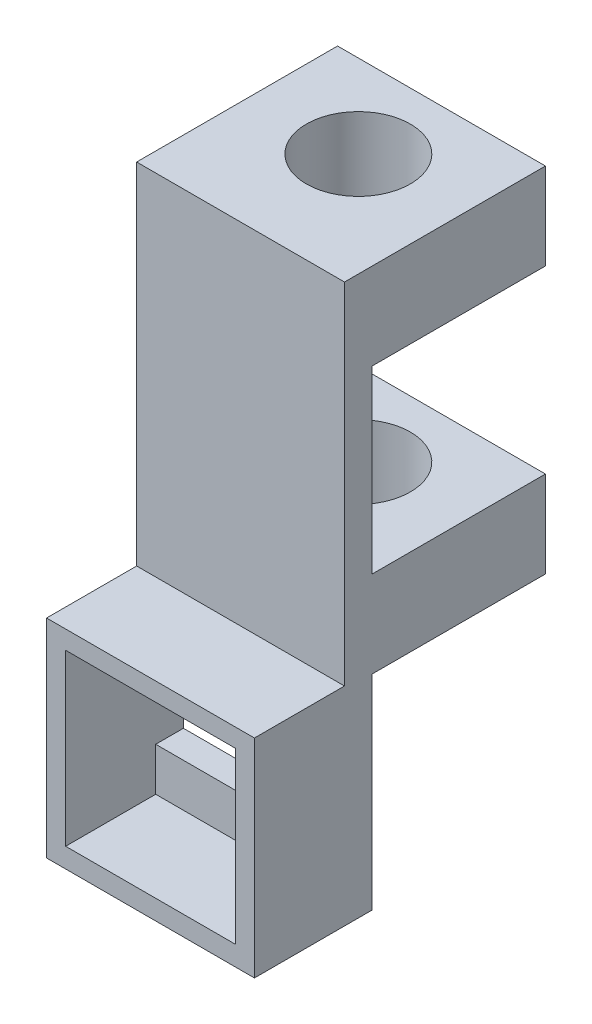
ISO-10303-21;
HEADER;
FILE_DESCRIPTION(('STEP AP214'),'2;1');
FILE_NAME('part.step','',(''),(''),'','','');
FILE_SCHEMA(('AUTOMOTIVE_DESIGN { 1 0 10303 214 1 1 1 1 }'));
ENDSEC;
DATA;
#1=APPLICATION_CONTEXT('core data for automotive mechanical design processes');
#2=APPLICATION_PROTOCOL_DEFINITION('international standard','automotive_design',2000,#1);
#3=PRODUCT_CONTEXT('',#1,'mechanical');
#4=PRODUCT('Part','Part','',(#3));
#5=PRODUCT_RELATED_PRODUCT_CATEGORY('part','',(#4));
#6=PRODUCT_DEFINITION_FORMATION('','',#4);
#7=PRODUCT_DEFINITION_CONTEXT('part definition',#1,'design');
#8=PRODUCT_DEFINITION('design','',#6,#7);
#9=PRODUCT_DEFINITION_SHAPE('','',#8);
#10=(LENGTH_UNIT() NAMED_UNIT(*) SI_UNIT(.MILLI.,.METRE.));
#11=(NAMED_UNIT(*) PLANE_ANGLE_UNIT() SI_UNIT($,.RADIAN.));
#12=(NAMED_UNIT(*) SI_UNIT($,.STERADIAN.) SOLID_ANGLE_UNIT());
#13=UNCERTAINTY_MEASURE_WITH_UNIT(LENGTH_MEASURE(1.E-05),#10,'distance_accuracy_value','');
#14=(GEOMETRIC_REPRESENTATION_CONTEXT(3) GLOBAL_UNCERTAINTY_ASSIGNED_CONTEXT((#13)) GLOBAL_UNIT_ASSIGNED_CONTEXT((#10,
#11,#12)) REPRESENTATION_CONTEXT('',''));
#15=CARTESIAN_POINT('',(0.,0.,0.));
#16=DIRECTION('',(0.,0.,1.));
#17=DIRECTION('',(1.,0.,0.));
#18=AXIS2_PLACEMENT_3D('',#15,#16,#17);
#19=CARTESIAN_POINT('',(0.,0.,1.016));
#20=DIRECTION('',(0.,0.,-1.));
#21=DIRECTION('',(-1.,0.,0.));
#22=AXIS2_PLACEMENT_3D('',#19,#20,#21);
#23=PLANE('',#22);
#24=DIRECTION('',(-1.,0.,0.));
#25=VECTOR('',#24,1.);
#26=CARTESIAN_POINT('',(-3.1115,-4.86634895045482,1.016));
#27=LINE('',#26,#25);
#28=CARTESIAN_POINT('',(3.1115,-4.86634895045482,1.016));
#29=VERTEX_POINT('',#28);
#30=CARTESIAN_POINT('',(-3.1115,-4.86634895045482,1.016));
#31=VERTEX_POINT('',#30);
#32=EDGE_CURVE('E188',#29,#31,#27,.T.);
#33=ORIENTED_EDGE('',*,*,#32,.F.);
#34=DIRECTION('',(0.,1.,0.));
#35=VECTOR('',#34,1.);
#36=CARTESIAN_POINT('',(3.1115,-9.50184895045482,1.016));
#37=LINE('',#36,#35);
#38=CARTESIAN_POINT('',(3.1115,-3.27884895045482,1.016));
#39=VERTEX_POINT('',#38);
#40=EDGE_CURVE('E383',#29,#39,#37,.T.);
#41=ORIENTED_EDGE('',*,*,#40,.T.);
#42=DIRECTION('',(-1.,0.,0.));
#43=VECTOR('',#42,1.);
#44=CARTESIAN_POINT('',(-3.1115,-3.27884895045482,1.016));
#45=LINE('',#44,#43);
#46=CARTESIAN_POINT('',(-3.1115,-3.27884895045482,1.016));
#47=VERTEX_POINT('',#46);
#48=EDGE_CURVE('E197',#39,#47,#45,.T.);
#49=ORIENTED_EDGE('',*,*,#48,.T.);
#50=DIRECTION('',(0.,-1.,0.));
#51=VECTOR('',#50,1.);
#52=CARTESIAN_POINT('',(-3.1115,-9.50184895045482,1.016));
#53=LINE('',#52,#51);
#54=EDGE_CURVE('E179',#47,#31,#53,.T.);
#55=ORIENTED_EDGE('',*,*,#54,.T.);
#56=EDGE_LOOP('',(#33,#41,#49,#55));
#57=FACE_BOUND('',#56,.T.);
#58=ADVANCED_FACE('F39',(#57),#23,.F.);
#59=DIRECTION('',(1.,0.,0.));
#60=VECTOR('',#59,1.);
#61=CARTESIAN_POINT('',(1.524,-7.91434895045482,1.016));
#62=LINE('',#61,#60);
#63=CARTESIAN_POINT('',(-3.1115,-7.91434895045482,1.016));
#64=VERTEX_POINT('',#63);
#65=CARTESIAN_POINT('',(3.1115,-7.91434895045482,1.016));
#66=VERTEX_POINT('',#65);
#67=EDGE_CURVE('E185',#64,#66,#62,.T.);
#68=ORIENTED_EDGE('',*,*,#67,.F.);
#69=CARTESIAN_POINT('',(-3.1115,-9.50184895045482,1.016));
#70=VERTEX_POINT('',#69);
#71=EDGE_CURVE('E200',#64,#70,#53,.T.);
#72=ORIENTED_EDGE('',*,*,#71,.T.);
#73=DIRECTION('',(1.,0.,0.));
#74=VECTOR('',#73,1.);
#75=CARTESIAN_POINT('',(-3.1115,-9.50184895045482,1.016));
#76=LINE('',#75,#74);
#77=CARTESIAN_POINT('',(3.1115,-9.50184895045482,1.016));
#78=VERTEX_POINT('',#77);
#79=EDGE_CURVE('E199',#70,#78,#76,.T.);
#80=ORIENTED_EDGE('',*,*,#79,.T.);
#81=EDGE_CURVE('E388',#78,#66,#37,.T.);
#82=ORIENTED_EDGE('',*,*,#81,.T.);
#83=EDGE_LOOP('',(#68,#72,#80,#82));
#84=FACE_BOUND('',#83,.T.);
#85=ADVANCED_FACE('F406',(#84),#23,.F.);
#86=DIRECTION('',(-1.,0.,0.));
#87=VECTOR('',#86,1.);
#88=CARTESIAN_POINT('',(-3.81000000000002,-2.6035,1.016));
#89=LINE('',#88,#87);
#90=CARTESIAN_POINT('',(3.81000000000001,-2.6035,1.016));
#91=VERTEX_POINT('',#90);
#92=CARTESIAN_POINT('',(-3.81000000000002,-2.6035,1.016));
#93=VERTEX_POINT('',#92);
#94=EDGE_CURVE('E225',#91,#93,#89,.T.);
#95=ORIENTED_EDGE('',*,*,#94,.F.);
#96=DIRECTION('',(0.,1.,0.));
#97=VECTOR('',#96,1.);
#98=CARTESIAN_POINT('',(3.81000000000001,-10.2235,1.016));
#99=LINE('',#98,#97);
#100=CARTESIAN_POINT('',(3.81000000000001,10.2235,1.016));
#101=VERTEX_POINT('',#100);
#102=EDGE_CURVE('E326',#91,#101,#99,.T.);
#103=ORIENTED_EDGE('',*,*,#102,.T.);
#104=DIRECTION('',(-1.,0.,0.));
#105=VECTOR('',#104,1.);
#106=CARTESIAN_POINT('',(-3.80999999999999,10.2235,1.016));
#107=LINE('',#106,#105);
#108=CARTESIAN_POINT('',(-3.80999999999999,10.2235,1.016));
#109=VERTEX_POINT('',#108);
#110=EDGE_CURVE('E329',#101,#109,#107,.T.);
#111=ORIENTED_EDGE('',*,*,#110,.T.);
#112=DIRECTION('',(0.,-1.,0.));
#113=VECTOR('',#112,1.);
#114=CARTESIAN_POINT('',(-3.80999999999999,-10.2235,1.016));
#115=LINE('',#114,#113);
#116=EDGE_CURVE('E333',#109,#93,#115,.T.);
#117=ORIENTED_EDGE('',*,*,#116,.T.);
#118=EDGE_LOOP('',(#95,#103,#111,#117));
#119=FACE_BOUND('',#118,.T.);
#120=ADVANCED_FACE('F432',(#119),#23,.F.);
#121=CARTESIAN_POINT('',(0.,0.,0.));
#122=DIRECTION('',(0.,0.,-1.));
#123=DIRECTION('',(-1.,0.,0.));
#124=AXIS2_PLACEMENT_3D('',#121,#122,#123);
#125=PLANE('',#124);
#126=DIRECTION('',(0.,-1.,0.));
#127=VECTOR('',#126,1.);
#128=CARTESIAN_POINT('',(3.1115,0.,0.));
#129=LINE('',#128,#127);
#130=CARTESIAN_POINT('',(3.1115,-4.86634895045482,0.));
#131=VERTEX_POINT('',#130);
#132=CARTESIAN_POINT('',(3.1115,-7.91434895045482,0.));
#133=VERTEX_POINT('',#132);
#134=EDGE_CURVE('E11',#131,#133,#129,.T.);
#135=ORIENTED_EDGE('',*,*,#134,.F.);
#136=DIRECTION('',(1.,0.,0.));
#137=VECTOR('',#136,1.);
#138=CARTESIAN_POINT('',(0.,-4.86634895045482,0.));
#139=LINE('',#138,#137);
#140=CARTESIAN_POINT('',(-3.1115,-4.86634895045482,0.));
#141=VERTEX_POINT('',#140);
#142=EDGE_CURVE('E361',#141,#131,#139,.T.);
#143=ORIENTED_EDGE('',*,*,#142,.F.);
#144=DIRECTION('',(0.,1.,0.));
#145=VECTOR('',#144,1.);
#146=CARTESIAN_POINT('',(-3.1115,0.,0.));
#147=LINE('',#146,#145);
#148=CARTESIAN_POINT('',(-3.1115,-7.91434895045482,0.));
#149=VERTEX_POINT('',#148);
#150=EDGE_CURVE('E182',#149,#141,#147,.T.);
#151=ORIENTED_EDGE('',*,*,#150,.F.);
#152=DIRECTION('',(-1.,0.,0.));
#153=VECTOR('',#152,1.);
#154=CARTESIAN_POINT('',(0.,-7.91434895045482,0.));
#155=LINE('',#154,#153);
#156=EDGE_CURVE('E48',#133,#149,#155,.T.);
#157=ORIENTED_EDGE('',*,*,#156,.F.);
#158=EDGE_LOOP('',(#135,#143,#151,#157));
#159=FACE_BOUND('',#158,.T.);
#160=DIRECTION('',(0.,-1.,0.));
#161=VECTOR('',#160,1.);
#162=CARTESIAN_POINT('',(-3.80999999999999,-10.2235,0.));
#163=LINE('',#162,#161);
#164=CARTESIAN_POINT('',(-3.80999999999999,-2.7305,0.));
#165=VERTEX_POINT('',#164);
#166=CARTESIAN_POINT('',(-3.80999999999999,-10.2235,0.));
#167=VERTEX_POINT('',#166);
#168=EDGE_CURVE('E341',#165,#167,#163,.T.);
#169=ORIENTED_EDGE('',*,*,#168,.F.);
#170=DIRECTION('',(-1.,0.,0.));
#171=VECTOR('',#170,1.);
#172=CARTESIAN_POINT('',(3.81000000000001,-2.7305,0.));
#173=LINE('',#172,#171);
#174=CARTESIAN_POINT('',(3.81000000000001,-2.7305,0.));
#175=VERTEX_POINT('',#174);
#176=EDGE_CURVE('E265',#175,#165,#173,.T.);
#177=ORIENTED_EDGE('',*,*,#176,.F.);
#178=DIRECTION('',(0.,1.,0.));
#179=VECTOR('',#178,1.);
#180=CARTESIAN_POINT('',(3.81000000000001,-10.2235,0.));
#181=LINE('',#180,#179);
#182=CARTESIAN_POINT('',(3.81000000000001,-10.2235,0.));
#183=VERTEX_POINT('',#182);
#184=EDGE_CURVE('E337',#183,#175,#181,.T.);
#185=ORIENTED_EDGE('',*,*,#184,.F.);
#186=DIRECTION('',(1.,0.,0.));
#187=VECTOR('',#186,1.);
#188=CARTESIAN_POINT('',(-3.80999999999999,-10.2235,0.));
#189=LINE('',#188,#187);
#190=EDGE_CURVE('E330',#167,#183,#189,.T.);
#191=ORIENTED_EDGE('',*,*,#190,.F.);
#192=EDGE_LOOP('',(#169,#177,#185,#191));
#193=FACE_BOUND('',#192,.T.);
#194=ADVANCED_FACE('F378',(#159,#193),#125,.T.);
#195=CARTESIAN_POINT('',(3.81000000000001,0.4445,0.));
#196=VERTEX_POINT('',#195);
#197=CARTESIAN_POINT('',(3.81000000000001,7.0485,0.));
#198=VERTEX_POINT('',#197);
#199=EDGE_CURVE('E325',#196,#198,#181,.T.);
#200=ORIENTED_EDGE('',*,*,#199,.F.);
#201=DIRECTION('',(1.,0.,0.));
#202=VECTOR('',#201,1.);
#203=CARTESIAN_POINT('',(3.81000000000001,0.4445,0.));
#204=LINE('',#203,#202);
#205=CARTESIAN_POINT('',(-3.80999999999999,0.4445,0.));
#206=VERTEX_POINT('',#205);
#207=EDGE_CURVE('E271',#206,#196,#204,.T.);
#208=ORIENTED_EDGE('',*,*,#207,.F.);
#209=CARTESIAN_POINT('',(-3.80999999999999,7.0485,0.));
#210=VERTEX_POINT('',#209);
#211=EDGE_CURVE('E342',#210,#206,#163,.T.);
#212=ORIENTED_EDGE('',*,*,#211,.F.);
#213=DIRECTION('',(-1.,0.,0.));
#214=VECTOR('',#213,1.);
#215=CARTESIAN_POINT('',(3.81000000000001,7.0485,0.));
#216=LINE('',#215,#214);
#217=EDGE_CURVE('E298',#198,#210,#216,.T.);
#218=ORIENTED_EDGE('',*,*,#217,.F.);
#219=EDGE_LOOP('',(#200,#208,#212,#218));
#220=FACE_BOUND('',#219,.T.);
#221=ADVANCED_FACE('F443',(#220),#125,.T.);
#222=CARTESIAN_POINT('',(3.81000000000001,-10.2235,1.016));
#223=DIRECTION('',(-1.,0.,0.));
#224=DIRECTION('',(0.,0.,1.));
#225=AXIS2_PLACEMENT_3D('',#222,#223,#224);
#226=PLANE('',#225);
#227=ORIENTED_EDGE('',*,*,#184,.T.);
#228=DIRECTION('',(0.,0.,1.));
#229=VECTOR('',#228,1.);
#230=CARTESIAN_POINT('',(3.81000000000001,-2.7305,-6.35));
#231=LINE('',#230,#229);
#232=CARTESIAN_POINT('',(3.81000000000001,-2.7305,-6.35));
#233=VERTEX_POINT('',#232);
#234=EDGE_CURVE('E295',#233,#175,#231,.T.);
#235=ORIENTED_EDGE('',*,*,#234,.F.);
#236=DIRECTION('',(0.,-1.,0.));
#237=VECTOR('',#236,1.);
#238=CARTESIAN_POINT('',(3.81000000000001,0.4445,-6.35));
#239=LINE('',#238,#237);
#240=CARTESIAN_POINT('',(3.81000000000001,0.4445,-6.35));
#241=VERTEX_POINT('',#240);
#242=EDGE_CURVE('E266',#241,#233,#239,.T.);
#243=ORIENTED_EDGE('',*,*,#242,.F.);
#244=DIRECTION('',(0.,0.,1.));
#245=VECTOR('',#244,1.);
#246=CARTESIAN_POINT('',(3.81000000000001,0.4445,-6.35));
#247=LINE('',#246,#245);
#248=EDGE_CURVE('E280',#241,#196,#247,.T.);
#249=ORIENTED_EDGE('',*,*,#248,.T.);
#250=ORIENTED_EDGE('',*,*,#199,.T.);
#251=DIRECTION('',(0.,0.,1.));
#252=VECTOR('',#251,1.);
#253=CARTESIAN_POINT('',(3.81000000000001,7.0485,-6.35));
#254=LINE('',#253,#252);
#255=CARTESIAN_POINT('',(3.81000000000001,7.0485,-6.35));
#256=VERTEX_POINT('',#255);
#257=EDGE_CURVE('E321',#256,#198,#254,.T.);
#258=ORIENTED_EDGE('',*,*,#257,.F.);
#259=DIRECTION('',(0.,-1.,0.));
#260=VECTOR('',#259,1.);
#261=CARTESIAN_POINT('',(3.81000000000001,10.2235,-6.35));
#262=LINE('',#261,#260);
#263=CARTESIAN_POINT('',(3.81000000000001,10.2235,-6.35));
#264=VERTEX_POINT('',#263);
#265=EDGE_CURVE('E299',#264,#256,#262,.T.);
#266=ORIENTED_EDGE('',*,*,#265,.F.);
#267=DIRECTION('',(0.,0.,-1.));
#268=VECTOR('',#267,1.);
#269=CARTESIAN_POINT('',(3.81000000000001,10.2235,1.016));
#270=LINE('',#269,#268);
#271=EDGE_CURVE('E358',#101,#264,#270,.T.);
#272=ORIENTED_EDGE('',*,*,#271,.F.);
#273=ORIENTED_EDGE('',*,*,#102,.F.);
#274=DIRECTION('',(0.,0.,-1.));
#275=VECTOR('',#274,1.);
#276=CARTESIAN_POINT('',(3.81000000000001,-2.6035,4.318));
#277=LINE('',#276,#275);
#278=CARTESIAN_POINT('',(3.81000000000001,-2.6035,4.318));
#279=VERTEX_POINT('',#278);
#280=EDGE_CURVE('E248',#279,#91,#277,.T.);
#281=ORIENTED_EDGE('',*,*,#280,.F.);
#282=DIRECTION('',(0.,1.,0.));
#283=VECTOR('',#282,1.);
#284=CARTESIAN_POINT('',(3.81000000000001,-2.6035,4.318));
#285=LINE('',#284,#283);
#286=CARTESIAN_POINT('',(3.81000000000001,-10.2235,4.318));
#287=VERTEX_POINT('',#286);
#288=EDGE_CURVE('E226',#287,#279,#285,.T.);
#289=ORIENTED_EDGE('',*,*,#288,.F.);
#290=DIRECTION('',(0.,0.,-1.));
#291=VECTOR('',#290,1.);
#292=CARTESIAN_POINT('',(3.81000000000001,-10.2235,1.016));
#293=LINE('',#292,#291);
#294=EDGE_CURVE('E336',#287,#183,#293,.T.);
#295=ORIENTED_EDGE('',*,*,#294,.T.);
#296=EDGE_LOOP('',(#227,#235,#243,#249,#250,#258,#266,#272,#273,#281,#289,#295));
#297=FACE_BOUND('',#296,.T.);
#298=ADVANCED_FACE('F41',(#297),#226,.F.);
#299=CARTESIAN_POINT('',(-3.80999999999999,10.2235,1.016));
#300=DIRECTION('',(0.,-1.,0.));
#301=DIRECTION('',(0.,0.,-1.));
#302=AXIS2_PLACEMENT_3D('',#299,#300,#301);
#303=PLANE('',#302);
#304=CARTESIAN_POINT('',(0.,10.2235,-3.302));
#305=DIRECTION('',(0.,1.,0.));
#306=DIRECTION('',(0.,0.,1.));
#307=AXIS2_PLACEMENT_3D('',#304,#305,#306);
#308=CIRCLE('',#307,1.905);
#309=CARTESIAN_POINT('',(0.,10.2235,-1.397));
#310=VERTEX_POINT('',#309);
#311=EDGE_CURVE('E252',#310,#310,#308,.T.);
#312=ORIENTED_EDGE('',*,*,#311,.F.);
#313=EDGE_LOOP('',(#312));
#314=FACE_BOUND('',#313,.T.);
#315=ORIENTED_EDGE('',*,*,#271,.T.);
#316=DIRECTION('',(1.,0.,0.));
#317=VECTOR('',#316,1.);
#318=CARTESIAN_POINT('',(3.81000000000001,10.2235,-6.35));
#319=LINE('',#318,#317);
#320=CARTESIAN_POINT('',(-3.80999999999999,10.2235,-6.35));
#321=VERTEX_POINT('',#320);
#322=EDGE_CURVE('E310',#321,#264,#319,.T.);
#323=ORIENTED_EDGE('',*,*,#322,.F.);
#324=DIRECTION('',(0.,0.,-1.));
#325=VECTOR('',#324,1.);
#326=CARTESIAN_POINT('',(-3.80999999999999,10.2235,1.016));
#327=LINE('',#326,#325);
#328=EDGE_CURVE('E355',#109,#321,#327,.T.);
#329=ORIENTED_EDGE('',*,*,#328,.F.);
#330=ORIENTED_EDGE('',*,*,#110,.F.);
#331=EDGE_LOOP('',(#315,#323,#329,#330));
#332=FACE_BOUND('',#331,.T.);
#333=ADVANCED_FACE('F493',(#314,#332),#303,.F.);
#334=CARTESIAN_POINT('',(-3.80999999999999,-10.2235,1.016));
#335=DIRECTION('',(1.,0.,0.));
#336=DIRECTION('',(0.,0.,-1.));
#337=AXIS2_PLACEMENT_3D('',#334,#335,#336);
#338=PLANE('',#337);
#339=ORIENTED_EDGE('',*,*,#328,.T.);
#340=DIRECTION('',(0.,1.,0.));
#341=VECTOR('',#340,1.);
#342=CARTESIAN_POINT('',(-3.80999999999999,10.2235,-6.35));
#343=LINE('',#342,#341);
#344=CARTESIAN_POINT('',(-3.80999999999999,7.0485,-6.35));
#345=VERTEX_POINT('',#344);
#346=EDGE_CURVE('E306',#345,#321,#343,.T.);
#347=ORIENTED_EDGE('',*,*,#346,.F.);
#348=DIRECTION('',(0.,0.,1.));
#349=VECTOR('',#348,1.);
#350=CARTESIAN_POINT('',(-3.80999999999999,7.0485,-6.35));
#351=LINE('',#350,#349);
#352=EDGE_CURVE('E314',#345,#210,#351,.T.);
#353=ORIENTED_EDGE('',*,*,#352,.T.);
#354=ORIENTED_EDGE('',*,*,#211,.T.);
#355=DIRECTION('',(0.,0.,1.));
#356=VECTOR('',#355,1.);
#357=CARTESIAN_POINT('',(-3.80999999999999,0.4445,-6.35));
#358=LINE('',#357,#356);
#359=CARTESIAN_POINT('',(-3.80999999999999,0.4445,-6.35));
#360=VERTEX_POINT('',#359);
#361=EDGE_CURVE('E288',#360,#206,#358,.T.);
#362=ORIENTED_EDGE('',*,*,#361,.F.);
#363=DIRECTION('',(0.,1.,0.));
#364=VECTOR('',#363,1.);
#365=CARTESIAN_POINT('',(-3.80999999999999,0.4445,-6.35));
#366=LINE('',#365,#364);
#367=CARTESIAN_POINT('',(-3.80999999999999,-2.7305,-6.35));
#368=VERTEX_POINT('',#367);
#369=EDGE_CURVE('E274',#368,#360,#366,.T.);
#370=ORIENTED_EDGE('',*,*,#369,.F.);
#371=DIRECTION('',(0.,0.,1.));
#372=VECTOR('',#371,1.);
#373=CARTESIAN_POINT('',(-3.80999999999999,-2.7305,-6.35));
#374=LINE('',#373,#372);
#375=EDGE_CURVE('E291',#368,#165,#374,.T.);
#376=ORIENTED_EDGE('',*,*,#375,.T.);
#377=ORIENTED_EDGE('',*,*,#168,.T.);
#378=DIRECTION('',(0.,0.,-1.));
#379=VECTOR('',#378,1.);
#380=CARTESIAN_POINT('',(-3.80999999999999,-10.2235,1.016));
#381=LINE('',#380,#379);
#382=CARTESIAN_POINT('',(-3.81000000000001,-10.2235,4.318));
#383=VERTEX_POINT('',#382);
#384=EDGE_CURVE('E351',#383,#167,#381,.T.);
#385=ORIENTED_EDGE('',*,*,#384,.F.);
#386=DIRECTION('',(0.,-1.,0.));
#387=VECTOR('',#386,1.);
#388=CARTESIAN_POINT('',(-3.81000000000002,-2.6035,4.318));
#389=LINE('',#388,#387);
#390=CARTESIAN_POINT('',(-3.81000000000002,-2.6035,4.318));
#391=VERTEX_POINT('',#390);
#392=EDGE_CURVE('E233',#391,#383,#389,.T.);
#393=ORIENTED_EDGE('',*,*,#392,.F.);
#394=DIRECTION('',(0.,0.,-1.));
#395=VECTOR('',#394,1.);
#396=CARTESIAN_POINT('',(-3.81000000000002,-2.6035,4.318));
#397=LINE('',#396,#395);
#398=EDGE_CURVE('E241',#391,#93,#397,.T.);
#399=ORIENTED_EDGE('',*,*,#398,.T.);
#400=ORIENTED_EDGE('',*,*,#116,.F.);
#401=EDGE_LOOP('',(#339,#347,#353,#354,#362,#370,#376,#377,#385,#393,#399,#400));
#402=FACE_BOUND('',#401,.T.);
#403=ADVANCED_FACE('F469',(#402),#338,.F.);
#404=CARTESIAN_POINT('',(-3.80999999999999,-10.2235,1.016));
#405=DIRECTION('',(0.,1.,0.));
#406=DIRECTION('',(0.,0.,1.));
#407=AXIS2_PLACEMENT_3D('',#404,#405,#406);
#408=PLANE('',#407);
#409=ORIENTED_EDGE('',*,*,#190,.T.);
#410=ORIENTED_EDGE('',*,*,#294,.F.);
#411=DIRECTION('',(1.,0.,0.));
#412=VECTOR('',#411,1.);
#413=CARTESIAN_POINT('',(-3.81000000000001,-10.2235,4.318));
#414=LINE('',#413,#412);
#415=EDGE_CURVE('E237',#383,#287,#414,.T.);
#416=ORIENTED_EDGE('',*,*,#415,.F.);
#417=ORIENTED_EDGE('',*,*,#384,.T.);
#418=EDGE_LOOP('',(#409,#410,#416,#417));
#419=FACE_BOUND('',#418,.T.);
#420=ADVANCED_FACE('F494',(#419),#408,.F.);
#421=CARTESIAN_POINT('',(3.81000000000001,7.0485,-6.35));
#422=DIRECTION('',(0.,1.,0.));
#423=DIRECTION('',(0.,0.,1.));
#424=AXIS2_PLACEMENT_3D('',#421,#422,#423);
#425=PLANE('',#424);
#426=CARTESIAN_POINT('',(0.,7.0485,-3.302));
#427=DIRECTION('',(0.,1.,0.));
#428=DIRECTION('',(0.,0.,1.));
#429=AXIS2_PLACEMENT_3D('',#426,#427,#428);
#430=CIRCLE('',#429,1.905);
#431=CARTESIAN_POINT('',(0.,7.0485,-1.397));
#432=VERTEX_POINT('',#431);
#433=EDGE_CURVE('E261',#432,#432,#430,.T.);
#434=ORIENTED_EDGE('',*,*,#433,.T.);
#435=EDGE_LOOP('',(#434));
#436=FACE_BOUND('',#435,.T.);
#437=ORIENTED_EDGE('',*,*,#217,.T.);
#438=ORIENTED_EDGE('',*,*,#352,.F.);
#439=DIRECTION('',(-1.,0.,0.));
#440=VECTOR('',#439,1.);
#441=CARTESIAN_POINT('',(3.81000000000001,7.0485,-6.35));
#442=LINE('',#441,#440);
#443=EDGE_CURVE('E303',#256,#345,#442,.T.);
#444=ORIENTED_EDGE('',*,*,#443,.F.);
#445=ORIENTED_EDGE('',*,*,#257,.T.);
#446=EDGE_LOOP('',(#437,#438,#444,#445));
#447=FACE_BOUND('',#446,.T.);
#448=ADVANCED_FACE('F486',(#436,#447),#425,.F.);
#449=CARTESIAN_POINT('',(0.,0.,-6.35));
#450=DIRECTION('',(0.,0.,-1.));
#451=DIRECTION('',(-1.,0.,0.));
#452=AXIS2_PLACEMENT_3D('',#449,#450,#451);
#453=PLANE('',#452);
#454=ORIENTED_EDGE('',*,*,#265,.T.);
#455=ORIENTED_EDGE('',*,*,#443,.T.);
#456=ORIENTED_EDGE('',*,*,#346,.T.);
#457=ORIENTED_EDGE('',*,*,#322,.T.);
#458=EDGE_LOOP('',(#454,#455,#456,#457));
#459=FACE_BOUND('',#458,.T.);
#460=ADVANCED_FACE('F488',(#459),#453,.T.);
#461=CARTESIAN_POINT('',(3.81000000000001,-2.7305,-6.35));
#462=DIRECTION('',(0.,1.,0.));
#463=DIRECTION('',(-1.,0.,0.));
#464=AXIS2_PLACEMENT_3D('',#461,#462,#463);
#465=PLANE('',#464);
#466=CARTESIAN_POINT('',(0.,-2.7305,-3.302));
#467=DIRECTION('',(0.,1.,0.));
#468=DIRECTION('',(-1.,0.,0.));
#469=AXIS2_PLACEMENT_3D('',#466,#467,#468);
#470=CIRCLE('',#469,1.905);
#471=CARTESIAN_POINT('',(-1.905,-2.7305,-3.302));
#472=VERTEX_POINT('',#471);
#473=EDGE_CURVE('E257',#472,#472,#470,.T.);
#474=ORIENTED_EDGE('',*,*,#473,.T.);
#475=EDGE_LOOP('',(#474));
#476=FACE_BOUND('',#475,.T.);
#477=ORIENTED_EDGE('',*,*,#176,.T.);
#478=ORIENTED_EDGE('',*,*,#375,.F.);
#479=DIRECTION('',(-1.,0.,0.));
#480=VECTOR('',#479,1.);
#481=CARTESIAN_POINT('',(3.81000000000001,-2.7305,-6.35));
#482=LINE('',#481,#480);
#483=EDGE_CURVE('E270',#233,#368,#482,.T.);
#484=ORIENTED_EDGE('',*,*,#483,.F.);
#485=ORIENTED_EDGE('',*,*,#234,.T.);
#486=EDGE_LOOP('',(#477,#478,#484,#485));
#487=FACE_BOUND('',#486,.T.);
#488=ADVANCED_FACE('F466',(#476,#487),#465,.F.);
#489=CARTESIAN_POINT('',(3.81000000000001,0.4445,-6.35));
#490=DIRECTION('',(0.,-1.,0.));
#491=DIRECTION('',(0.,0.,-1.));
#492=AXIS2_PLACEMENT_3D('',#489,#490,#491);
#493=PLANE('',#492);
#494=CARTESIAN_POINT('',(0.,0.4445,-3.302));
#495=DIRECTION('',(0.,-1.,0.));
#496=DIRECTION('',(0.,0.,-1.));
#497=AXIS2_PLACEMENT_3D('',#494,#495,#496);
#498=CIRCLE('',#497,1.905);
#499=CARTESIAN_POINT('',(0.,0.4445,-5.207));
#500=VERTEX_POINT('',#499);
#501=EDGE_CURVE('E256',#500,#500,#498,.T.);
#502=ORIENTED_EDGE('',*,*,#501,.T.);
#503=EDGE_LOOP('',(#502));
#504=FACE_BOUND('',#503,.T.);
#505=ORIENTED_EDGE('',*,*,#207,.T.);
#506=ORIENTED_EDGE('',*,*,#248,.F.);
#507=DIRECTION('',(1.,0.,0.));
#508=VECTOR('',#507,1.);
#509=CARTESIAN_POINT('',(3.81000000000001,0.4445,-6.35));
#510=LINE('',#509,#508);
#511=EDGE_CURVE('E277',#360,#241,#510,.T.);
#512=ORIENTED_EDGE('',*,*,#511,.F.);
#513=ORIENTED_EDGE('',*,*,#361,.T.);
#514=EDGE_LOOP('',(#505,#506,#512,#513));
#515=FACE_BOUND('',#514,.T.);
#516=ADVANCED_FACE('F526',(#504,#515),#493,.F.);
#517=CARTESIAN_POINT('',(0.,0.,-6.35));
#518=DIRECTION('',(0.,0.,-1.));
#519=DIRECTION('',(-1.,0.,0.));
#520=AXIS2_PLACEMENT_3D('',#517,#518,#519);
#521=PLANE('',#520);
#522=ORIENTED_EDGE('',*,*,#242,.T.);
#523=ORIENTED_EDGE('',*,*,#483,.T.);
#524=ORIENTED_EDGE('',*,*,#369,.T.);
#525=ORIENTED_EDGE('',*,*,#511,.T.);
#526=EDGE_LOOP('',(#522,#523,#524,#525));
#527=FACE_BOUND('',#526,.T.);
#528=ADVANCED_FACE('F473',(#527),#521,.T.);
#529=CARTESIAN_POINT('',(0.,-10.2235,-3.302));
#530=DIRECTION('',(0.,1.,0.));
#531=DIRECTION('',(0.,0.,1.));
#532=AXIS2_PLACEMENT_3D('',#529,#530,#531);
#533=CYLINDRICAL_SURFACE('',#532,1.905);
#534=ORIENTED_EDGE('',*,*,#501,.F.);
#535=EDGE_LOOP('',(#534));
#536=FACE_BOUND('',#535,.T.);
#537=ORIENTED_EDGE('',*,*,#473,.F.);
#538=EDGE_LOOP('',(#537));
#539=FACE_BOUND('',#538,.T.);
#540=ADVANCED_FACE('F513',(#536,#539),#533,.F.);
#541=ORIENTED_EDGE('',*,*,#311,.T.);
#542=EDGE_LOOP('',(#541));
#543=FACE_BOUND('',#542,.T.);
#544=ORIENTED_EDGE('',*,*,#433,.F.);
#545=EDGE_LOOP('',(#544));
#546=FACE_BOUND('',#545,.T.);
#547=ADVANCED_FACE('F510',(#543,#546),#533,.F.);
#548=CARTESIAN_POINT('',(0.,0.,4.318));
#549=DIRECTION('',(0.,0.,1.));
#550=DIRECTION('',(1.,0.,0.));
#551=AXIS2_PLACEMENT_3D('',#548,#549,#550);
#552=PLANE('',#551);
#553=ORIENTED_EDGE('',*,*,#288,.T.);
#554=DIRECTION('',(-1.,0.,0.));
#555=VECTOR('',#554,1.);
#556=CARTESIAN_POINT('',(-3.81000000000002,-2.6035,4.318));
#557=LINE('',#556,#555);
#558=EDGE_CURVE('E230',#279,#391,#557,.T.);
#559=ORIENTED_EDGE('',*,*,#558,.T.);
#560=ORIENTED_EDGE('',*,*,#392,.T.);
#561=ORIENTED_EDGE('',*,*,#415,.T.);
#562=EDGE_LOOP('',(#553,#559,#560,#561));
#563=FACE_BOUND('',#562,.T.);
#564=DIRECTION('',(-1.,0.,0.));
#565=VECTOR('',#564,1.);
#566=CARTESIAN_POINT('',(-3.1115,-3.27884895045482,4.318));
#567=LINE('',#566,#565);
#568=CARTESIAN_POINT('',(3.1115,-3.27884895045482,4.318));
#569=VERTEX_POINT('',#568);
#570=CARTESIAN_POINT('',(-3.1115,-3.27884895045482,4.318));
#571=VERTEX_POINT('',#570);
#572=EDGE_CURVE('E394',#569,#571,#567,.T.);
#573=ORIENTED_EDGE('',*,*,#572,.F.);
#574=DIRECTION('',(0.,1.,0.));
#575=VECTOR('',#574,1.);
#576=CARTESIAN_POINT('',(3.1115,-9.50184895045482,4.318));
#577=LINE('',#576,#575);
#578=CARTESIAN_POINT('',(3.1115,-9.50184895045482,4.318));
#579=VERTEX_POINT('',#578);
#580=EDGE_CURVE('E205',#579,#569,#577,.T.);
#581=ORIENTED_EDGE('',*,*,#580,.F.);
#582=DIRECTION('',(1.,0.,0.));
#583=VECTOR('',#582,1.);
#584=CARTESIAN_POINT('',(-3.1115,-9.50184895045482,4.318));
#585=LINE('',#584,#583);
#586=CARTESIAN_POINT('',(-3.1115,-9.50184895045482,4.318));
#587=VERTEX_POINT('',#586);
#588=EDGE_CURVE('E214',#587,#579,#585,.T.);
#589=ORIENTED_EDGE('',*,*,#588,.F.);
#590=DIRECTION('',(0.,-1.,0.));
#591=VECTOR('',#590,1.);
#592=CARTESIAN_POINT('',(-3.1115,-9.50184895045482,4.318));
#593=LINE('',#592,#591);
#594=EDGE_CURVE('E397',#571,#587,#593,.T.);
#595=ORIENTED_EDGE('',*,*,#594,.F.);
#596=EDGE_LOOP('',(#573,#581,#589,#595));
#597=FACE_BOUND('',#596,.T.);
#598=ADVANCED_FACE('F416',(#563,#597),#552,.T.);
#599=CARTESIAN_POINT('',(-3.81000000000002,-2.6035,4.318));
#600=DIRECTION('',(0.,-1.,0.));
#601=DIRECTION('',(0.,0.,-1.));
#602=AXIS2_PLACEMENT_3D('',#599,#600,#601);
#603=PLANE('',#602);
#604=ORIENTED_EDGE('',*,*,#94,.T.);
#605=ORIENTED_EDGE('',*,*,#398,.F.);
#606=ORIENTED_EDGE('',*,*,#558,.F.);
#607=ORIENTED_EDGE('',*,*,#280,.T.);
#608=EDGE_LOOP('',(#604,#605,#606,#607));
#609=FACE_BOUND('',#608,.T.);
#610=ADVANCED_FACE('F454',(#609),#603,.F.);
#611=CARTESIAN_POINT('',(3.1115,-9.50184895045482,4.318));
#612=DIRECTION('',(-1.,0.,0.));
#613=DIRECTION('',(0.,-1.,0.));
#614=AXIS2_PLACEMENT_3D('',#611,#612,#613);
#615=PLANE('',#614);
#616=ORIENTED_EDGE('',*,*,#81,.F.);
#617=DIRECTION('',(0.,0.,-1.));
#618=VECTOR('',#617,1.);
#619=CARTESIAN_POINT('',(3.1115,-9.50184895045482,4.318));
#620=LINE('',#619,#618);
#621=EDGE_CURVE('E210',#579,#78,#620,.T.);
#622=ORIENTED_EDGE('',*,*,#621,.F.);
#623=ORIENTED_EDGE('',*,*,#580,.T.);
#624=DIRECTION('',(0.,0.,-1.));
#625=VECTOR('',#624,1.);
#626=CARTESIAN_POINT('',(3.1115,-3.27884895045482,4.318));
#627=LINE('',#626,#625);
#628=EDGE_CURVE('E221',#569,#39,#627,.T.);
#629=ORIENTED_EDGE('',*,*,#628,.T.);
#630=ORIENTED_EDGE('',*,*,#40,.F.);
#631=DIRECTION('',(0.,0.,1.));
#632=VECTOR('',#631,1.);
#633=CARTESIAN_POINT('',(3.1115,-4.86634895045482,-6.35));
#634=LINE('',#633,#632);
#635=EDGE_CURVE('E191',#131,#29,#634,.T.);
#636=ORIENTED_EDGE('',*,*,#635,.F.);
#637=ORIENTED_EDGE('',*,*,#134,.T.);
#638=DIRECTION('',(0.,0.,1.));
#639=VECTOR('',#638,1.);
#640=CARTESIAN_POINT('',(3.1115,-7.91434895045482,-6.35));
#641=LINE('',#640,#639);
#642=EDGE_CURVE('E372',#133,#66,#641,.T.);
#643=ORIENTED_EDGE('',*,*,#642,.T.);
#644=EDGE_LOOP('',(#616,#622,#623,#629,#630,#636,#637,#643));
#645=FACE_BOUND('',#644,.T.);
#646=ADVANCED_FACE('F382',(#645),#615,.T.);
#647=CARTESIAN_POINT('',(-3.1115,-3.27884895045482,4.318));
#648=DIRECTION('',(0.,-1.,0.));
#649=DIRECTION('',(1.,0.,0.));
#650=AXIS2_PLACEMENT_3D('',#647,#648,#649);
#651=PLANE('',#650);
#652=ORIENTED_EDGE('',*,*,#48,.F.);
#653=ORIENTED_EDGE('',*,*,#628,.F.);
#654=ORIENTED_EDGE('',*,*,#572,.T.);
#655=DIRECTION('',(0.,0.,-1.));
#656=VECTOR('',#655,1.);
#657=CARTESIAN_POINT('',(-3.1115,-3.27884895045482,4.318));
#658=LINE('',#657,#656);
#659=EDGE_CURVE('E218',#571,#47,#658,.T.);
#660=ORIENTED_EDGE('',*,*,#659,.T.);
#661=EDGE_LOOP('',(#652,#653,#654,#660));
#662=FACE_BOUND('',#661,.T.);
#663=ADVANCED_FACE('F419',(#662),#651,.T.);
#664=CARTESIAN_POINT('',(-3.1115,-9.50184895045482,4.318));
#665=DIRECTION('',(1.,0.,0.));
#666=DIRECTION('',(0.,0.,-1.));
#667=AXIS2_PLACEMENT_3D('',#664,#665,#666);
#668=PLANE('',#667);
#669=ORIENTED_EDGE('',*,*,#54,.F.);
#670=ORIENTED_EDGE('',*,*,#659,.F.);
#671=ORIENTED_EDGE('',*,*,#594,.T.);
#672=DIRECTION('',(0.,0.,-1.));
#673=VECTOR('',#672,1.);
#674=CARTESIAN_POINT('',(-3.1115,-9.50184895045482,4.318));
#675=LINE('',#674,#673);
#676=EDGE_CURVE('E213',#587,#70,#675,.T.);
#677=ORIENTED_EDGE('',*,*,#676,.T.);
#678=ORIENTED_EDGE('',*,*,#71,.F.);
#679=DIRECTION('',(0.,0.,1.));
#680=VECTOR('',#679,1.);
#681=CARTESIAN_POINT('',(-3.1115,-7.91434895045482,-6.35));
#682=LINE('',#681,#680);
#683=EDGE_CURVE('E55',#149,#64,#682,.T.);
#684=ORIENTED_EDGE('',*,*,#683,.F.);
#685=ORIENTED_EDGE('',*,*,#150,.T.);
#686=DIRECTION('',(0.,0.,1.));
#687=VECTOR('',#686,1.);
#688=CARTESIAN_POINT('',(-3.1115,-4.86634895045482,-6.35));
#689=LINE('',#688,#687);
#690=EDGE_CURVE('E63',#141,#31,#689,.T.);
#691=ORIENTED_EDGE('',*,*,#690,.T.);
#692=EDGE_LOOP('',(#669,#670,#671,#677,#678,#684,#685,#691));
#693=FACE_BOUND('',#692,.T.);
#694=ADVANCED_FACE('F176',(#693),#668,.T.);
#695=CARTESIAN_POINT('',(-3.1115,-9.50184895045482,4.318));
#696=DIRECTION('',(0.,1.,0.));
#697=DIRECTION('',(-1.,0.,0.));
#698=AXIS2_PLACEMENT_3D('',#695,#696,#697);
#699=PLANE('',#698);
#700=ORIENTED_EDGE('',*,*,#79,.F.);
#701=ORIENTED_EDGE('',*,*,#676,.F.);
#702=ORIENTED_EDGE('',*,*,#588,.T.);
#703=ORIENTED_EDGE('',*,*,#621,.T.);
#704=EDGE_LOOP('',(#700,#701,#702,#703));
#705=FACE_BOUND('',#704,.T.);
#706=ADVANCED_FACE('F420',(#705),#699,.T.);
#707=CARTESIAN_POINT('',(1.524,-7.91434895045482,-6.35));
#708=DIRECTION('',(0.,-1.,0.));
#709=DIRECTION('',(0.,0.,-1.));
#710=AXIS2_PLACEMENT_3D('',#707,#708,#709);
#711=PLANE('',#710);
#712=ORIENTED_EDGE('',*,*,#156,.T.);
#713=ORIENTED_EDGE('',*,*,#683,.T.);
#714=ORIENTED_EDGE('',*,*,#67,.T.);
#715=ORIENTED_EDGE('',*,*,#642,.F.);
#716=EDGE_LOOP('',(#712,#713,#714,#715));
#717=FACE_BOUND('',#716,.T.);
#718=ADVANCED_FACE('F371',(#717),#711,.F.);
#719=CARTESIAN_POINT('',(-3.1115,-4.86634895045482,-6.35));
#720=DIRECTION('',(0.,1.,0.));
#721=DIRECTION('',(0.,0.,1.));
#722=AXIS2_PLACEMENT_3D('',#719,#720,#721);
#723=PLANE('',#722);
#724=ORIENTED_EDGE('',*,*,#142,.T.);
#725=ORIENTED_EDGE('',*,*,#635,.T.);
#726=ORIENTED_EDGE('',*,*,#32,.T.);
#727=ORIENTED_EDGE('',*,*,#690,.F.);
#728=EDGE_LOOP('',(#724,#725,#726,#727));
#729=FACE_BOUND('',#728,.T.);
#730=ADVANCED_FACE('F189',(#729),#723,.F.);
#731=CLOSED_SHELL('',(#58,#85,#120,#194,#221,#298,#333,#403,#420,#448,#460,#488,#516,#528,#540,
#547,#598,#610,#646,#663,#694,#706,#718,#730));
#732=MANIFOLD_SOLID_BREP('B2',#731);
#733=ADVANCED_BREP_SHAPE_REPRESENTATION('',(#18,#732),#14);
#734=SHAPE_DEFINITION_REPRESENTATION(#9,#733);
ENDSEC;
END-ISO-10303-21;
